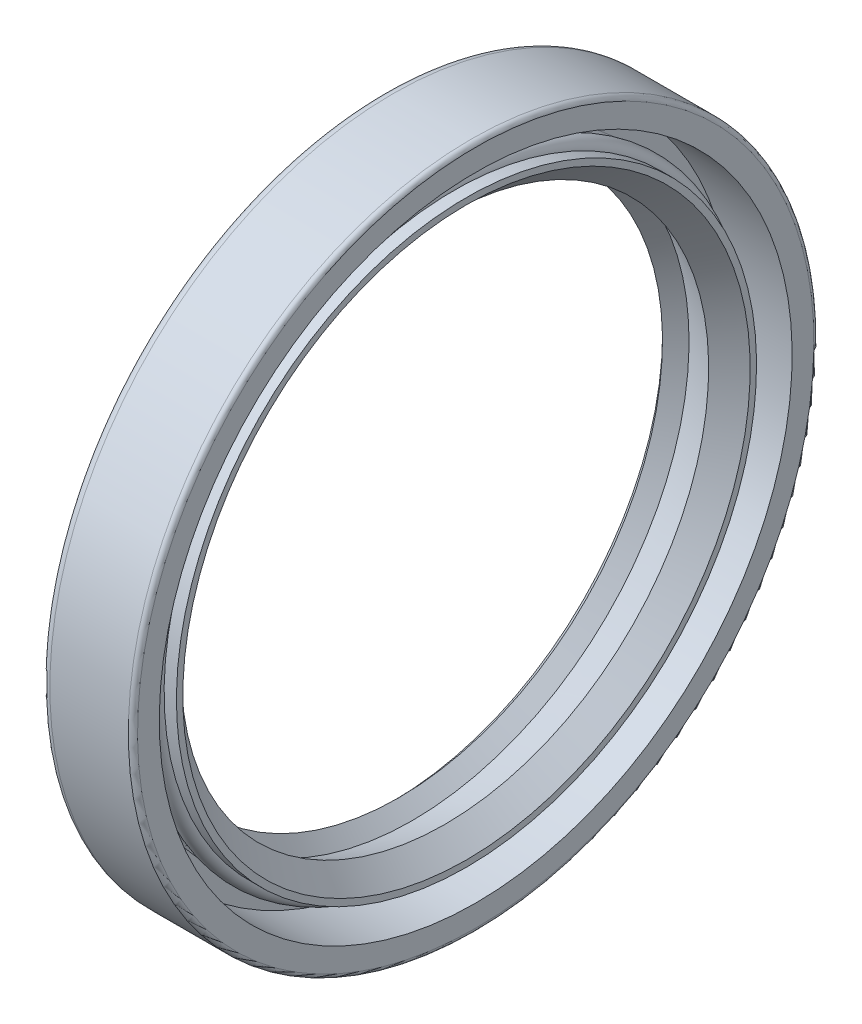
ISO-10303-21;
HEADER;
FILE_DESCRIPTION(('STEP AP214'),'2;1');
FILE_NAME('part.step','',(''),(''),'','','');
FILE_SCHEMA(('AUTOMOTIVE_DESIGN { 1 0 10303 214 1 1 1 1 }'));
ENDSEC;
DATA;
#1=APPLICATION_CONTEXT('core data for automotive mechanical design processes');
#2=APPLICATION_PROTOCOL_DEFINITION('international standard','automotive_design',2000,#1);
#3=PRODUCT_CONTEXT('',#1,'mechanical');
#4=PRODUCT('Part','Part','',(#3));
#5=PRODUCT_RELATED_PRODUCT_CATEGORY('part','',(#4));
#6=PRODUCT_DEFINITION_FORMATION('','',#4);
#7=PRODUCT_DEFINITION_CONTEXT('part definition',#1,'design');
#8=PRODUCT_DEFINITION('design','',#6,#7);
#9=PRODUCT_DEFINITION_SHAPE('','',#8);
#10=(LENGTH_UNIT() NAMED_UNIT(*) SI_UNIT(.MILLI.,.METRE.));
#11=(NAMED_UNIT(*) PLANE_ANGLE_UNIT() SI_UNIT($,.RADIAN.));
#12=(NAMED_UNIT(*) SI_UNIT($,.STERADIAN.) SOLID_ANGLE_UNIT());
#13=UNCERTAINTY_MEASURE_WITH_UNIT(LENGTH_MEASURE(1.E-05),#10,'distance_accuracy_value','');
#14=(GEOMETRIC_REPRESENTATION_CONTEXT(3) GLOBAL_UNCERTAINTY_ASSIGNED_CONTEXT((#13)) GLOBAL_UNIT_ASSIGNED_CONTEXT((#10,
#11,#12)) REPRESENTATION_CONTEXT('',''));
#15=CARTESIAN_POINT('',(0.,0.,0.));
#16=DIRECTION('',(0.,0.,1.));
#17=DIRECTION('',(1.,0.,0.));
#18=AXIS2_PLACEMENT_3D('',#15,#16,#17);
#19=CARTESIAN_POINT('',(4.66666666666667,0.,0.));
#20=DIRECTION('',(-1.,0.,0.));
#21=DIRECTION('',(0.,0.,1.));
#22=AXIS2_PLACEMENT_3D('',#19,#20,#21);
#23=TOROIDAL_SURFACE('',#22,22.,0.699999999999999);
#24=CARTESIAN_POINT('',(4.66666666666667,0.,22.7));
#25=VERTEX_POINT('',#24);
#26=VERTEX_LOOP('',#25);
#27=FACE_BOUND('',#26,.T.);
#28=ADVANCED_FACE('F45',(#27),#23,.T.);
#29=CLOSED_SHELL('',(#28));
#30=MANIFOLD_SOLID_BREP('B2',#29);
#31=CARTESIAN_POINT('',(0.,25.3,0.));
#32=DIRECTION('',(1.,0.,0.));
#33=DIRECTION('',(0.,1.,0.));
#34=AXIS2_PLACEMENT_3D('',#31,#32,#33);
#35=PLANE('',#34);
#36=CARTESIAN_POINT('',(0.,0.,0.));
#37=DIRECTION('',(-1.,0.,0.));
#38=DIRECTION('',(0.,-1.,0.));
#39=AXIS2_PLACEMENT_3D('',#36,#37,#38);
#40=CIRCLE('',#39,24.);
#41=CARTESIAN_POINT('',(0.,-24.,0.));
#42=VERTEX_POINT('',#41);
#43=EDGE_CURVE('E44',#42,#42,#40,.T.);
#44=ORIENTED_EDGE('',*,*,#43,.F.);
#45=EDGE_LOOP('',(#44));
#46=FACE_BOUND('',#45,.T.);
#47=CARTESIAN_POINT('',(0.,0.,0.));
#48=DIRECTION('',(-1.,0.,0.));
#49=DIRECTION('',(0.,-1.,0.));
#50=AXIS2_PLACEMENT_3D('',#47,#48,#49);
#51=CIRCLE('',#50,25.3);
#52=CARTESIAN_POINT('',(0.,-25.3,0.));
#53=VERTEX_POINT('',#52);
#54=EDGE_CURVE('E151',#53,#53,#51,.T.);
#55=ORIENTED_EDGE('',*,*,#54,.T.);
#56=EDGE_LOOP('',(#55));
#57=FACE_BOUND('',#56,.T.);
#58=ADVANCED_FACE('F58',(#46,#57),#35,.F.);
#59=CARTESIAN_POINT('',(7.,0.,0.));
#60=DIRECTION('',(-1.,0.,0.));
#61=DIRECTION('',(0.,-1.,0.));
#62=AXIS2_PLACEMENT_3D('',#59,#60,#61);
#63=CYLINDRICAL_SURFACE('',#62,24.);
#64=CARTESIAN_POINT('',(0.21875,0.,0.));
#65=DIRECTION('',(-1.,0.,0.));
#66=DIRECTION('',(0.,-1.,0.));
#67=AXIS2_PLACEMENT_3D('',#64,#65,#66);
#68=CIRCLE('',#67,24.);
#69=CARTESIAN_POINT('',(0.21875,-24.,0.));
#70=VERTEX_POINT('',#69);
#71=EDGE_CURVE('E65',#70,#70,#68,.T.);
#72=ORIENTED_EDGE('',*,*,#71,.F.);
#73=EDGE_LOOP('',(#72));
#74=FACE_BOUND('',#73,.T.);
#75=ORIENTED_EDGE('',*,*,#43,.T.);
#76=EDGE_LOOP('',(#75));
#77=FACE_BOUND('',#76,.T.);
#78=ADVANCED_FACE('F274',(#74,#77),#63,.F.);
#79=CARTESIAN_POINT('',(0.21875,24.,0.));
#80=DIRECTION('',(1.,0.,0.));
#81=DIRECTION('',(0.,1.,0.));
#82=AXIS2_PLACEMENT_3D('',#79,#80,#81);
#83=PLANE('',#82);
#84=CARTESIAN_POINT('',(0.21875,0.,0.));
#85=DIRECTION('',(-1.,0.,0.));
#86=DIRECTION('',(0.,-1.,0.));
#87=AXIS2_PLACEMENT_3D('',#84,#85,#86);
#88=CIRCLE('',#87,22.);
#89=CARTESIAN_POINT('',(0.21875,-22.,0.));
#90=VERTEX_POINT('',#89);
#91=EDGE_CURVE('E71',#90,#90,#88,.T.);
#92=ORIENTED_EDGE('',*,*,#91,.F.);
#93=EDGE_LOOP('',(#92));
#94=FACE_BOUND('',#93,.T.);
#95=ORIENTED_EDGE('',*,*,#71,.T.);
#96=EDGE_LOOP('',(#95));
#97=FACE_BOUND('',#96,.T.);
#98=ADVANCED_FACE('F269',(#94,#97),#83,.F.);
#99=CARTESIAN_POINT('',(7.,0.,0.));
#100=DIRECTION('',(-1.,0.,0.));
#101=DIRECTION('',(0.,-1.,0.));
#102=AXIS2_PLACEMENT_3D('',#99,#100,#101);
#103=CYLINDRICAL_SURFACE('',#102,22.);
#104=CARTESIAN_POINT('',(0.,0.,0.));
#105=DIRECTION('',(-1.,0.,0.));
#106=DIRECTION('',(0.,-1.,0.));
#107=AXIS2_PLACEMENT_3D('',#104,#105,#106);
#108=CIRCLE('',#107,22.);
#109=CARTESIAN_POINT('',(0.,-22.,0.));
#110=VERTEX_POINT('',#109);
#111=EDGE_CURVE('E77',#110,#110,#108,.T.);
#112=ORIENTED_EDGE('',*,*,#111,.F.);
#113=EDGE_LOOP('',(#112));
#114=FACE_BOUND('',#113,.T.);
#115=ORIENTED_EDGE('',*,*,#91,.T.);
#116=EDGE_LOOP('',(#115));
#117=FACE_BOUND('',#116,.T.);
#118=ADVANCED_FACE('F263',(#114,#117),#103,.T.);
#119=CARTESIAN_POINT('',(0.,22.,0.));
#120=DIRECTION('',(1.,0.,0.));
#121=DIRECTION('',(0.,1.,0.));
#122=AXIS2_PLACEMENT_3D('',#119,#120,#121);
#123=PLANE('',#122);
#124=CARTESIAN_POINT('',(0.,0.,0.));
#125=DIRECTION('',(-1.,0.,0.));
#126=DIRECTION('',(0.,-1.,0.));
#127=AXIS2_PLACEMENT_3D('',#124,#125,#126);
#128=CIRCLE('',#127,21.5);
#129=CARTESIAN_POINT('',(0.,-21.5,0.));
#130=VERTEX_POINT('',#129);
#131=EDGE_CURVE('E83',#130,#130,#128,.T.);
#132=ORIENTED_EDGE('',*,*,#131,.F.);
#133=EDGE_LOOP('',(#132));
#134=FACE_BOUND('',#133,.T.);
#135=ORIENTED_EDGE('',*,*,#111,.T.);
#136=EDGE_LOOP('',(#135));
#137=FACE_BOUND('',#136,.T.);
#138=ADVANCED_FACE('F257',(#134,#137),#123,.F.);
#139=CARTESIAN_POINT('',(0.,0.,0.));
#140=DIRECTION('',(-1.,0.,0.));
#141=DIRECTION('',(0.,-1.,0.));
#142=AXIS2_PLACEMENT_3D('',#139,#140,#141);
#143=CONICAL_SURFACE('',#142,21.5,0.404891786285084);
#144=CARTESIAN_POINT('',(1.16666666666667,0.,0.));
#145=DIRECTION('',(-1.,0.,0.));
#146=DIRECTION('',(0.,-1.,0.));
#147=AXIS2_PLACEMENT_3D('',#144,#145,#146);
#148=CIRCLE('',#147,21.);
#149=CARTESIAN_POINT('',(1.16666666666667,-21.,0.));
#150=VERTEX_POINT('',#149);
#151=EDGE_CURVE('E87',#150,#150,#148,.T.);
#152=ORIENTED_EDGE('',*,*,#151,.F.);
#153=EDGE_LOOP('',(#152));
#154=FACE_BOUND('',#153,.T.);
#155=ORIENTED_EDGE('',*,*,#131,.T.);
#156=EDGE_LOOP('',(#155));
#157=FACE_BOUND('',#156,.T.);
#158=ADVANCED_FACE('F251',(#154,#157),#143,.F.);
#159=CARTESIAN_POINT('',(1.16666666666667,0.,0.));
#160=DIRECTION('',(1.,0.,0.));
#161=DIRECTION('',(0.,1.,0.));
#162=AXIS2_PLACEMENT_3D('',#159,#160,#161);
#163=CONICAL_SURFACE('',#162,21.,0.778156476387518);
#164=CARTESIAN_POINT('',(0.666719107780701,0.,0.));
#165=DIRECTION('',(-1.,0.,0.));
#166=DIRECTION('',(0.,-1.,0.));
#167=AXIS2_PLACEMENT_3D('',#164,#165,#166);
#168=CIRCLE('',#167,20.5072414338334);
#169=CARTESIAN_POINT('',(0.666719107780701,-20.5072414338334,0.));
#170=VERTEX_POINT('',#169);
#171=EDGE_CURVE('E91',#170,#170,#168,.T.);
#172=ORIENTED_EDGE('',*,*,#171,.F.);
#173=EDGE_LOOP('',(#172));
#174=FACE_BOUND('',#173,.T.);
#175=ORIENTED_EDGE('',*,*,#151,.T.);
#176=EDGE_LOOP('',(#175));
#177=FACE_BOUND('',#176,.T.);
#178=ADVANCED_FACE('F245',(#174,#177),#163,.T.);
#179=CARTESIAN_POINT('',(0.666719107780701,0.,0.));
#180=DIRECTION('',(-1.,0.,0.));
#181=DIRECTION('',(0.,-1.,0.));
#182=AXIS2_PLACEMENT_3D('',#179,#180,#181);
#183=CONICAL_SURFACE('',#182,20.5072414338334,0.792639850407377);
#184=CARTESIAN_POINT('',(1.16666666666667,0.,0.));
#185=DIRECTION('',(-1.,0.,0.));
#186=DIRECTION('',(0.,-1.,0.));
#187=AXIS2_PLACEMENT_3D('',#184,#185,#186);
#188=CIRCLE('',#187,20.);
#189=CARTESIAN_POINT('',(1.16666666666667,-20.,0.));
#190=VERTEX_POINT('',#189);
#191=EDGE_CURVE('E95',#190,#190,#188,.T.);
#192=ORIENTED_EDGE('',*,*,#191,.F.);
#193=EDGE_LOOP('',(#192));
#194=FACE_BOUND('',#193,.T.);
#195=ORIENTED_EDGE('',*,*,#171,.T.);
#196=EDGE_LOOP('',(#195));
#197=FACE_BOUND('',#196,.T.);
#198=ADVANCED_FACE('F239',(#194,#197),#183,.F.);
#199=CARTESIAN_POINT('',(1.16666666666667,0.,0.));
#200=DIRECTION('',(1.,0.,0.));
#201=DIRECTION('',(0.,1.,0.));
#202=AXIS2_PLACEMENT_3D('',#199,#200,#201);
#203=CONICAL_SURFACE('',#202,20.,0.77815647638752);
#204=CARTESIAN_POINT('',(2.18125594671773,0.,0.));
#205=DIRECTION('',(-1.,0.,0.));
#206=DIRECTION('',(0.,-1.,0.));
#207=AXIS2_PLACEMENT_3D('',#204,#205,#206);
#208=CIRCLE('',#207,21.);
#209=CARTESIAN_POINT('',(2.18125594671773,-21.,0.));
#210=VERTEX_POINT('',#209);
#211=EDGE_CURVE('E99',#210,#210,#208,.T.);
#212=ORIENTED_EDGE('',*,*,#211,.F.);
#213=EDGE_LOOP('',(#212));
#214=FACE_BOUND('',#213,.T.);
#215=ORIENTED_EDGE('',*,*,#191,.T.);
#216=EDGE_LOOP('',(#215));
#217=FACE_BOUND('',#216,.T.);
#218=ADVANCED_FACE('F233',(#214,#217),#203,.F.);
#219=CARTESIAN_POINT('',(2.18125594671773,0.,0.));
#220=DIRECTION('',(-1.,0.,0.));
#221=DIRECTION('',(0.,-1.,0.));
#222=AXIS2_PLACEMENT_3D('',#219,#220,#221);
#223=CONICAL_SURFACE('',#222,21.,0.382528863555344);
#224=CARTESIAN_POINT('',(4.66666666666667,0.,0.));
#225=DIRECTION('',(-1.,0.,0.));
#226=DIRECTION('',(0.,-1.,0.));
#227=AXIS2_PLACEMENT_3D('',#224,#225,#226);
#228=CIRCLE('',#227,20.);
#229=CARTESIAN_POINT('',(4.66666666666667,-20.,0.));
#230=VERTEX_POINT('',#229);
#231=EDGE_CURVE('E103',#230,#230,#228,.T.);
#232=ORIENTED_EDGE('',*,*,#231,.F.);
#233=EDGE_LOOP('',(#232));
#234=FACE_BOUND('',#233,.T.);
#235=ORIENTED_EDGE('',*,*,#211,.T.);
#236=EDGE_LOOP('',(#235));
#237=FACE_BOUND('',#236,.T.);
#238=ADVANCED_FACE('F227',(#234,#237),#223,.F.);
#239=CARTESIAN_POINT('',(4.66666666666667,0.,0.));
#240=DIRECTION('',(1.,0.,0.));
#241=DIRECTION('',(0.,1.,0.));
#242=AXIS2_PLACEMENT_3D('',#239,#240,#241);
#243=CONICAL_SURFACE('',#242,20.,0.748378047523382);
#244=CARTESIAN_POINT('',(6.3,0.,0.));
#245=DIRECTION('',(-1.,0.,0.));
#246=DIRECTION('',(0.,-1.,0.));
#247=AXIS2_PLACEMENT_3D('',#244,#245,#246);
#248=CIRCLE('',#247,21.5166666666663);
#249=CARTESIAN_POINT('',(6.3,-21.5166666666663,0.));
#250=VERTEX_POINT('',#249);
#251=EDGE_CURVE('E107',#250,#250,#248,.T.);
#252=ORIENTED_EDGE('',*,*,#251,.F.);
#253=EDGE_LOOP('',(#252));
#254=FACE_BOUND('',#253,.T.);
#255=ORIENTED_EDGE('',*,*,#231,.T.);
#256=EDGE_LOOP('',(#255));
#257=FACE_BOUND('',#256,.T.);
#258=ADVANCED_FACE('F221',(#254,#257),#243,.F.);
#259=CARTESIAN_POINT('',(6.3,21.5166666666663,0.));
#260=DIRECTION('',(-1.,0.,0.));
#261=DIRECTION('',(0.,-1.,0.));
#262=AXIS2_PLACEMENT_3D('',#259,#260,#261);
#263=PLANE('',#262);
#264=CARTESIAN_POINT('',(6.3,0.,0.));
#265=DIRECTION('',(-1.,0.,0.));
#266=DIRECTION('',(0.,-1.,0.));
#267=AXIS2_PLACEMENT_3D('',#264,#265,#266);
#268=CIRCLE('',#267,22.);
#269=CARTESIAN_POINT('',(6.3,-22.,0.));
#270=VERTEX_POINT('',#269);
#271=EDGE_CURVE('E111',#270,#270,#268,.T.);
#272=ORIENTED_EDGE('',*,*,#271,.F.);
#273=EDGE_LOOP('',(#272));
#274=FACE_BOUND('',#273,.T.);
#275=ORIENTED_EDGE('',*,*,#251,.T.);
#276=EDGE_LOOP('',(#275));
#277=FACE_BOUND('',#276,.T.);
#278=ADVANCED_FACE('F215',(#274,#277),#263,.F.);
#279=CARTESIAN_POINT('',(7.,0.,0.));
#280=DIRECTION('',(-1.,0.,0.));
#281=DIRECTION('',(0.,-1.,0.));
#282=AXIS2_PLACEMENT_3D('',#279,#280,#281);
#283=CYLINDRICAL_SURFACE('',#282,22.);
#284=CARTESIAN_POINT('',(5.36666666666667,0.,0.));
#285=DIRECTION('',(-1.,0.,0.));
#286=DIRECTION('',(0.,-1.,0.));
#287=AXIS2_PLACEMENT_3D('',#284,#285,#286);
#288=CIRCLE('',#287,22.);
#289=CARTESIAN_POINT('',(5.36666666666667,-22.,0.));
#290=VERTEX_POINT('',#289);
#291=EDGE_CURVE('E115',#290,#290,#288,.T.);
#292=ORIENTED_EDGE('',*,*,#291,.F.);
#293=EDGE_LOOP('',(#292));
#294=FACE_BOUND('',#293,.T.);
#295=ORIENTED_EDGE('',*,*,#271,.T.);
#296=EDGE_LOOP('',(#295));
#297=FACE_BOUND('',#296,.T.);
#298=ADVANCED_FACE('F209',(#294,#297),#283,.T.);
#299=CARTESIAN_POINT('',(4.66666666666667,0.,0.));
#300=DIRECTION('',(-1.,0.,0.));
#301=DIRECTION('',(0.,-1.,0.));
#302=AXIS2_PLACEMENT_3D('',#299,#300,#301);
#303=TOROIDAL_SURFACE('',#302,22.,0.7);
#304=CARTESIAN_POINT('',(3.96666666666667,0.,0.));
#305=DIRECTION('',(-1.,0.,0.));
#306=DIRECTION('',(0.,-1.,0.));
#307=AXIS2_PLACEMENT_3D('',#304,#305,#306);
#308=CIRCLE('',#307,22.);
#309=CARTESIAN_POINT('',(3.96666666666667,-22.,0.));
#310=VERTEX_POINT('',#309);
#311=EDGE_CURVE('E119',#310,#310,#308,.T.);
#312=ORIENTED_EDGE('',*,*,#311,.F.);
#313=EDGE_LOOP('',(#312));
#314=FACE_BOUND('',#313,.T.);
#315=ORIENTED_EDGE('',*,*,#291,.T.);
#316=EDGE_LOOP('',(#315));
#317=FACE_BOUND('',#316,.T.);
#318=ADVANCED_FACE('F203',(#314,#317),#303,.F.);
#319=CARTESIAN_POINT('',(7.,0.,0.));
#320=DIRECTION('',(-1.,0.,0.));
#321=DIRECTION('',(0.,-1.,0.));
#322=AXIS2_PLACEMENT_3D('',#319,#320,#321);
#323=CYLINDRICAL_SURFACE('',#322,22.);
#324=CARTESIAN_POINT('',(2.68333333333333,0.,0.));
#325=DIRECTION('',(-1.,0.,0.));
#326=DIRECTION('',(0.,-1.,0.));
#327=AXIS2_PLACEMENT_3D('',#324,#325,#326);
#328=CIRCLE('',#327,22.);
#329=CARTESIAN_POINT('',(2.68333333333333,-22.,0.));
#330=VERTEX_POINT('',#329);
#331=EDGE_CURVE('E123',#330,#330,#328,.T.);
#332=ORIENTED_EDGE('',*,*,#331,.F.);
#333=EDGE_LOOP('',(#332));
#334=FACE_BOUND('',#333,.T.);
#335=ORIENTED_EDGE('',*,*,#311,.T.);
#336=EDGE_LOOP('',(#335));
#337=FACE_BOUND('',#336,.T.);
#338=ADVANCED_FACE('F197',(#334,#337),#323,.T.);
#339=CARTESIAN_POINT('',(2.68333333333333,0.,0.));
#340=DIRECTION('',(-1.,0.,0.));
#341=DIRECTION('',(0.,-1.,0.));
#342=AXIS2_PLACEMENT_3D('',#339,#340,#341);
#343=TOROIDAL_SURFACE('',#342,22.35,0.35);
#344=CARTESIAN_POINT('',(2.33333333333333,0.,0.));
#345=DIRECTION('',(-1.,0.,0.));
#346=DIRECTION('',(0.,-1.,0.));
#347=AXIS2_PLACEMENT_3D('',#344,#345,#346);
#348=CIRCLE('',#347,22.35);
#349=CARTESIAN_POINT('',(2.33333333333333,-22.35,0.));
#350=VERTEX_POINT('',#349);
#351=EDGE_CURVE('E127',#350,#350,#348,.T.);
#352=ORIENTED_EDGE('',*,*,#351,.F.);
#353=EDGE_LOOP('',(#352));
#354=FACE_BOUND('',#353,.T.);
#355=ORIENTED_EDGE('',*,*,#331,.T.);
#356=EDGE_LOOP('',(#355));
#357=FACE_BOUND('',#356,.T.);
#358=ADVANCED_FACE('F191',(#354,#357),#343,.F.);
#359=CARTESIAN_POINT('',(2.33333333333333,22.35,0.));
#360=DIRECTION('',(-1.,0.,0.));
#361=DIRECTION('',(0.,-1.,0.));
#362=AXIS2_PLACEMENT_3D('',#359,#360,#361);
#363=PLANE('',#362);
#364=CARTESIAN_POINT('',(2.33333333333333,0.,0.));
#365=DIRECTION('',(-1.,0.,0.));
#366=DIRECTION('',(0.,-1.,0.));
#367=AXIS2_PLACEMENT_3D('',#364,#365,#366);
#368=CIRCLE('',#367,24.);
#369=CARTESIAN_POINT('',(2.33333333333333,-24.,0.));
#370=VERTEX_POINT('',#369);
#371=EDGE_CURVE('E131',#370,#370,#368,.T.);
#372=ORIENTED_EDGE('',*,*,#371,.F.);
#373=EDGE_LOOP('',(#372));
#374=FACE_BOUND('',#373,.T.);
#375=ORIENTED_EDGE('',*,*,#351,.T.);
#376=EDGE_LOOP('',(#375));
#377=FACE_BOUND('',#376,.T.);
#378=ADVANCED_FACE('F185',(#374,#377),#363,.F.);
#379=CARTESIAN_POINT('',(7.,0.,0.));
#380=DIRECTION('',(-1.,0.,0.));
#381=DIRECTION('',(0.,-1.,0.));
#382=AXIS2_PLACEMENT_3D('',#379,#380,#381);
#383=CYLINDRICAL_SURFACE('',#382,24.);
#384=CARTESIAN_POINT('',(7.,0.,0.));
#385=DIRECTION('',(-1.,0.,0.));
#386=DIRECTION('',(0.,-1.,0.));
#387=AXIS2_PLACEMENT_3D('',#384,#385,#386);
#388=CIRCLE('',#387,24.);
#389=CARTESIAN_POINT('',(7.,-24.,0.));
#390=VERTEX_POINT('',#389);
#391=EDGE_CURVE('E135',#390,#390,#388,.T.);
#392=ORIENTED_EDGE('',*,*,#391,.F.);
#393=EDGE_LOOP('',(#392));
#394=FACE_BOUND('',#393,.T.);
#395=ORIENTED_EDGE('',*,*,#371,.T.);
#396=EDGE_LOOP('',(#395));
#397=FACE_BOUND('',#396,.T.);
#398=ADVANCED_FACE('F179',(#394,#397),#383,.F.);
#399=CARTESIAN_POINT('',(7.,24.,0.));
#400=DIRECTION('',(-1.,0.,0.));
#401=DIRECTION('',(0.,-1.,0.));
#402=AXIS2_PLACEMENT_3D('',#399,#400,#401);
#403=PLANE('',#402);
#404=CARTESIAN_POINT('',(7.,0.,0.));
#405=DIRECTION('',(-1.,0.,0.));
#406=DIRECTION('',(0.,-1.,0.));
#407=AXIS2_PLACEMENT_3D('',#404,#405,#406);
#408=CIRCLE('',#407,25.65);
#409=CARTESIAN_POINT('',(7.,-25.65,0.));
#410=VERTEX_POINT('',#409);
#411=EDGE_CURVE('E139',#410,#410,#408,.T.);
#412=ORIENTED_EDGE('',*,*,#411,.F.);
#413=EDGE_LOOP('',(#412));
#414=FACE_BOUND('',#413,.T.);
#415=ORIENTED_EDGE('',*,*,#391,.T.);
#416=EDGE_LOOP('',(#415));
#417=FACE_BOUND('',#416,.T.);
#418=ADVANCED_FACE('F173',(#414,#417),#403,.F.);
#419=CARTESIAN_POINT('',(6.65,0.,0.));
#420=DIRECTION('',(-1.,0.,0.));
#421=DIRECTION('',(0.,-1.,0.));
#422=AXIS2_PLACEMENT_3D('',#419,#420,#421);
#423=TOROIDAL_SURFACE('',#422,25.65,0.35);
#424=CARTESIAN_POINT('',(6.65,0.,0.));
#425=DIRECTION('',(-1.,0.,0.));
#426=DIRECTION('',(0.,-1.,0.));
#427=AXIS2_PLACEMENT_3D('',#424,#425,#426);
#428=CIRCLE('',#427,26.);
#429=CARTESIAN_POINT('',(6.65,-26.,0.));
#430=VERTEX_POINT('',#429);
#431=EDGE_CURVE('E143',#430,#430,#428,.T.);
#432=ORIENTED_EDGE('',*,*,#431,.F.);
#433=EDGE_LOOP('',(#432));
#434=FACE_BOUND('',#433,.T.);
#435=ORIENTED_EDGE('',*,*,#411,.T.);
#436=EDGE_LOOP('',(#435));
#437=FACE_BOUND('',#436,.T.);
#438=ADVANCED_FACE('F167',(#434,#437),#423,.T.);
#439=CARTESIAN_POINT('',(7.,0.,0.));
#440=DIRECTION('',(-1.,0.,0.));
#441=DIRECTION('',(0.,-1.,0.));
#442=AXIS2_PLACEMENT_3D('',#439,#440,#441);
#443=CYLINDRICAL_SURFACE('',#442,26.);
#444=CARTESIAN_POINT('',(0.7,0.,0.));
#445=DIRECTION('',(-1.,0.,0.));
#446=DIRECTION('',(0.,-1.,0.));
#447=AXIS2_PLACEMENT_3D('',#444,#445,#446);
#448=CIRCLE('',#447,26.);
#449=CARTESIAN_POINT('',(0.7,-26.,0.));
#450=VERTEX_POINT('',#449);
#451=EDGE_CURVE('E147',#450,#450,#448,.T.);
#452=ORIENTED_EDGE('',*,*,#451,.F.);
#453=EDGE_LOOP('',(#452));
#454=FACE_BOUND('',#453,.T.);
#455=ORIENTED_EDGE('',*,*,#431,.T.);
#456=EDGE_LOOP('',(#455));
#457=FACE_BOUND('',#456,.T.);
#458=ADVANCED_FACE('F161',(#454,#457),#443,.T.);
#459=CARTESIAN_POINT('',(0.7,0.,0.));
#460=DIRECTION('',(-1.,0.,0.));
#461=DIRECTION('',(0.,-1.,0.));
#462=AXIS2_PLACEMENT_3D('',#459,#460,#461);
#463=TOROIDAL_SURFACE('',#462,25.3,0.7);
#464=ORIENTED_EDGE('',*,*,#54,.F.);
#465=EDGE_LOOP('',(#464));
#466=FACE_BOUND('',#465,.T.);
#467=ORIENTED_EDGE('',*,*,#451,.T.);
#468=EDGE_LOOP('',(#467));
#469=FACE_BOUND('',#468,.T.);
#470=ADVANCED_FACE('F158',(#466,#469),#463,.T.);
#471=CLOSED_SHELL('',(#58,#78,#98,#118,#138,#158,#178,#198,#218,#238,#258,#278,#298,#318,#338,
#358,#378,#398,#418,#438,#458,#470));
#472=MANIFOLD_SOLID_BREP('B6',#471);
#473=ADVANCED_BREP_SHAPE_REPRESENTATION('',(#18,#30,#472),#14);
#474=SHAPE_DEFINITION_REPRESENTATION(#9,#473);
ENDSEC;
END-ISO-10303-21;
